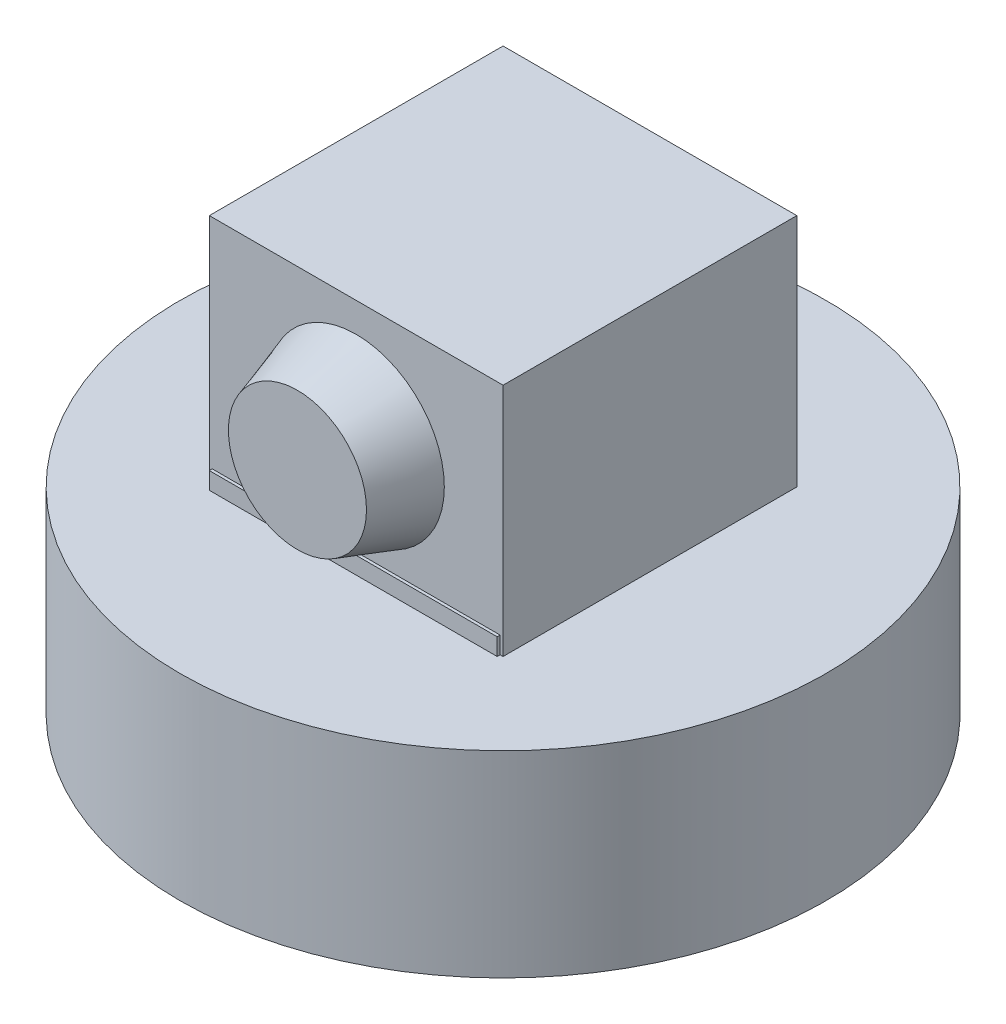
ISO-10303-21;
HEADER;
FILE_DESCRIPTION(('STEP AP214'),'2;1');
FILE_NAME('part.step','',(''),(''),'','','');
FILE_SCHEMA(('AUTOMOTIVE_DESIGN { 1 0 10303 214 1 1 1 1 }'));
ENDSEC;
DATA;
#1=APPLICATION_CONTEXT('core data for automotive mechanical design processes');
#2=APPLICATION_PROTOCOL_DEFINITION('international standard','automotive_design',2000,#1);
#3=PRODUCT_CONTEXT('',#1,'mechanical');
#4=PRODUCT('Part','Part','',(#3));
#5=PRODUCT_RELATED_PRODUCT_CATEGORY('part','',(#4));
#6=PRODUCT_DEFINITION_FORMATION('','',#4);
#7=PRODUCT_DEFINITION_CONTEXT('part definition',#1,'design');
#8=PRODUCT_DEFINITION('design','',#6,#7);
#9=PRODUCT_DEFINITION_SHAPE('','',#8);
#10=(LENGTH_UNIT() NAMED_UNIT(*) SI_UNIT(.MILLI.,.METRE.));
#11=(NAMED_UNIT(*) PLANE_ANGLE_UNIT() SI_UNIT($,.RADIAN.));
#12=(NAMED_UNIT(*) SI_UNIT($,.STERADIAN.) SOLID_ANGLE_UNIT());
#13=UNCERTAINTY_MEASURE_WITH_UNIT(LENGTH_MEASURE(1.E-05),#10,'distance_accuracy_value','');
#14=(GEOMETRIC_REPRESENTATION_CONTEXT(3) GLOBAL_UNCERTAINTY_ASSIGNED_CONTEXT((#13)) GLOBAL_UNIT_ASSIGNED_CONTEXT((#10,
#11,#12)) REPRESENTATION_CONTEXT('',''));
#15=CARTESIAN_POINT('',(0.,0.,0.));
#16=DIRECTION('',(0.,0.,1.));
#17=DIRECTION('',(1.,0.,0.));
#18=AXIS2_PLACEMENT_3D('',#15,#16,#17);
#19=CARTESIAN_POINT('',(0.,67.,0.));
#20=DIRECTION('',(0.,1.,0.));
#21=DIRECTION('',(0.,0.,1.));
#22=AXIS2_PLACEMENT_3D('',#19,#20,#21);
#23=PLANE('',#22);
#24=CARTESIAN_POINT('',(0.,67.,0.));
#25=DIRECTION('',(0.,1.,0.));
#26=DIRECTION('',(0.,0.,1.));
#27=AXIS2_PLACEMENT_3D('',#24,#25,#26);
#28=CIRCLE('',#27,110.);
#29=CARTESIAN_POINT('',(0.,67.,110.));
#30=VERTEX_POINT('',#29);
#31=EDGE_CURVE('E386',#30,#30,#28,.T.);
#32=ORIENTED_EDGE('',*,*,#31,.T.);
#33=EDGE_LOOP('',(#32));
#34=FACE_BOUND('',#33,.T.);
#35=DIRECTION('',(-1.,0.,0.));
#36=VECTOR('',#35,1.);
#37=CARTESIAN_POINT('',(0.,67.,51.));
#38=LINE('',#37,#36);
#39=CARTESIAN_POINT('',(49.,67.,51.));
#40=VERTEX_POINT('',#39);
#41=CARTESIAN_POINT('',(-49.,67.,51.));
#42=VERTEX_POINT('',#41);
#43=EDGE_CURVE('E277',#40,#42,#38,.T.);
#44=ORIENTED_EDGE('',*,*,#43,.T.);
#45=DIRECTION('',(0.,0.,-1.));
#46=VECTOR('',#45,1.);
#47=CARTESIAN_POINT('',(-49.,67.,0.));
#48=LINE('',#47,#46);
#49=CARTESIAN_POINT('',(-49.,67.,50.));
#50=VERTEX_POINT('',#49);
#51=EDGE_CURVE('E503',#42,#50,#48,.T.);
#52=ORIENTED_EDGE('',*,*,#51,.T.);
#53=DIRECTION('',(1.,0.,0.));
#54=VECTOR('',#53,1.);
#55=CARTESIAN_POINT('',(-50.,67.,50.));
#56=LINE('',#55,#54);
#57=CARTESIAN_POINT('',(-50.,67.,50.));
#58=VERTEX_POINT('',#57);
#59=EDGE_CURVE('E346',#58,#50,#56,.T.);
#60=ORIENTED_EDGE('',*,*,#59,.F.);
#61=DIRECTION('',(0.,0.,1.));
#62=VECTOR('',#61,1.);
#63=CARTESIAN_POINT('',(-50.,67.,-50.));
#64=LINE('',#63,#62);
#65=CARTESIAN_POINT('',(-50.,67.,-50.));
#66=VERTEX_POINT('',#65);
#67=EDGE_CURVE('E363',#66,#58,#64,.T.);
#68=ORIENTED_EDGE('',*,*,#67,.F.);
#69=DIRECTION('',(-1.,0.,0.));
#70=VECTOR('',#69,1.);
#71=CARTESIAN_POINT('',(-50.,67.,-50.));
#72=LINE('',#71,#70);
#73=CARTESIAN_POINT('',(50.,67.,-50.));
#74=VERTEX_POINT('',#73);
#75=EDGE_CURVE('E359',#74,#66,#72,.T.);
#76=ORIENTED_EDGE('',*,*,#75,.F.);
#77=DIRECTION('',(0.,0.,-1.));
#78=VECTOR('',#77,1.);
#79=CARTESIAN_POINT('',(50.,67.,-50.));
#80=LINE('',#79,#78);
#81=CARTESIAN_POINT('',(50.,67.,50.));
#82=VERTEX_POINT('',#81);
#83=EDGE_CURVE('E340',#82,#74,#80,.T.);
#84=ORIENTED_EDGE('',*,*,#83,.F.);
#85=CARTESIAN_POINT('',(49.,67.,50.));
#86=VERTEX_POINT('',#85);
#87=EDGE_CURVE('E367',#86,#82,#56,.T.);
#88=ORIENTED_EDGE('',*,*,#87,.F.);
#89=DIRECTION('',(0.,0.,1.));
#90=VECTOR('',#89,1.);
#91=CARTESIAN_POINT('',(49.,67.,0.));
#92=LINE('',#91,#90);
#93=EDGE_CURVE('E504',#86,#40,#92,.T.);
#94=ORIENTED_EDGE('',*,*,#93,.T.);
#95=EDGE_LOOP('',(#44,#52,#60,#68,#76,#84,#88,#94));
#96=FACE_BOUND('',#95,.T.);
#97=ADVANCED_FACE('F52',(#34,#96),#23,.T.);
#98=CARTESIAN_POINT('',(-50.,147.,50.));
#99=DIRECTION('',(0.,0.,-1.));
#100=DIRECTION('',(-1.,0.,0.));
#101=AXIS2_PLACEMENT_3D('',#98,#99,#100);
#102=PLANE('',#101);
#103=CARTESIAN_POINT('',(0.,107.,50.));
#104=DIRECTION('',(0.,0.,-1.));
#105=DIRECTION('',(-1.,0.,0.));
#106=AXIS2_PLACEMENT_3D('',#103,#104,#105);
#107=CIRCLE('',#106,30.);
#108=CARTESIAN_POINT('',(-30.,107.,50.));
#109=VERTEX_POINT('',#108);
#110=EDGE_CURVE('E62',#109,#109,#107,.F.);
#111=ORIENTED_EDGE('',*,*,#110,.F.);
#112=EDGE_LOOP('',(#111));
#113=FACE_BOUND('',#112,.T.);
#114=DIRECTION('',(0.,-1.,0.));
#115=VECTOR('',#114,1.);
#116=CARTESIAN_POINT('',(-49.,147.,50.));
#117=LINE('',#116,#115);
#118=CARTESIAN_POINT('',(-49.,72.8266894014951,50.));
#119=VERTEX_POINT('',#118);
#120=EDGE_CURVE('E495',#119,#50,#117,.T.);
#121=ORIENTED_EDGE('',*,*,#120,.F.);
#122=DIRECTION('',(-1.,0.,0.));
#123=VECTOR('',#122,1.);
#124=CARTESIAN_POINT('',(-50.,72.8266894014951,50.));
#125=LINE('',#124,#123);
#126=CARTESIAN_POINT('',(49.,72.8266894014951,50.));
#127=VERTEX_POINT('',#126);
#128=EDGE_CURVE('E497',#127,#119,#125,.T.);
#129=ORIENTED_EDGE('',*,*,#128,.F.);
#130=DIRECTION('',(0.,1.,0.));
#131=VECTOR('',#130,1.);
#132=CARTESIAN_POINT('',(49.,147.,50.));
#133=LINE('',#132,#131);
#134=EDGE_CURVE('E516',#86,#127,#133,.T.);
#135=ORIENTED_EDGE('',*,*,#134,.F.);
#136=ORIENTED_EDGE('',*,*,#87,.T.);
#137=DIRECTION('',(0.,-1.,0.));
#138=VECTOR('',#137,1.);
#139=CARTESIAN_POINT('',(50.,147.,50.));
#140=LINE('',#139,#138);
#141=CARTESIAN_POINT('',(50.,147.,50.));
#142=VERTEX_POINT('',#141);
#143=EDGE_CURVE('E355',#142,#82,#140,.T.);
#144=ORIENTED_EDGE('',*,*,#143,.F.);
#145=DIRECTION('',(1.,0.,0.));
#146=VECTOR('',#145,1.);
#147=CARTESIAN_POINT('',(-50.,147.,50.));
#148=LINE('',#147,#146);
#149=CARTESIAN_POINT('',(-50.,147.,50.));
#150=VERTEX_POINT('',#149);
#151=EDGE_CURVE('E352',#150,#142,#148,.T.);
#152=ORIENTED_EDGE('',*,*,#151,.F.);
#153=DIRECTION('',(0.,-1.,0.));
#154=VECTOR('',#153,1.);
#155=CARTESIAN_POINT('',(-50.,147.,50.));
#156=LINE('',#155,#154);
#157=EDGE_CURVE('E374',#150,#58,#156,.T.);
#158=ORIENTED_EDGE('',*,*,#157,.T.);
#159=ORIENTED_EDGE('',*,*,#59,.T.);
#160=EDGE_LOOP('',(#121,#129,#135,#136,#144,#152,#158,#159));
#161=FACE_BOUND('',#160,.T.);
#162=ADVANCED_FACE('F489',(#113,#161),#102,.F.);
#163=CARTESIAN_POINT('',(0.,0.,0.));
#164=DIRECTION('',(0.,1.,0.));
#165=DIRECTION('',(0.,0.,1.));
#166=AXIS2_PLACEMENT_3D('',#163,#164,#165);
#167=PLANE('',#166);
#168=CARTESIAN_POINT('',(0.,0.,0.));
#169=DIRECTION('',(0.,1.,0.));
#170=DIRECTION('',(0.,0.,1.));
#171=AXIS2_PLACEMENT_3D('',#168,#169,#170);
#172=CIRCLE('',#171,110.);
#173=CARTESIAN_POINT('',(0.,0.,110.));
#174=VERTEX_POINT('',#173);
#175=EDGE_CURVE('E480',#174,#174,#172,.T.);
#176=ORIENTED_EDGE('',*,*,#175,.F.);
#177=EDGE_LOOP('',(#176));
#178=FACE_BOUND('',#177,.T.);
#179=CARTESIAN_POINT('',(0.,0.,0.));
#180=DIRECTION('',(0.,1.,0.));
#181=DIRECTION('',(0.,0.,1.));
#182=AXIS2_PLACEMENT_3D('',#179,#180,#181);
#183=CIRCLE('',#182,9.45);
#184=CARTESIAN_POINT('',(-4.5,0.,-8.30978339067872));
#185=VERTEX_POINT('',#184);
#186=CARTESIAN_POINT('',(-4.5,0.,8.30978339067872));
#187=VERTEX_POINT('',#186);
#188=EDGE_CURVE('E390',#185,#187,#183,.T.);
#189=ORIENTED_EDGE('',*,*,#188,.T.);
#190=DIRECTION('',(0.,0.,1.));
#191=VECTOR('',#190,1.);
#192=CARTESIAN_POINT('',(-4.5,0.,8.30978339067872));
#193=LINE('',#192,#191);
#194=CARTESIAN_POINT('',(-4.5,0.,23.3097833906787));
#195=VERTEX_POINT('',#194);
#196=EDGE_CURVE('E428',#187,#195,#193,.T.);
#197=ORIENTED_EDGE('',*,*,#196,.T.);
#198=DIRECTION('',(1.,0.,0.));
#199=VECTOR('',#198,1.);
#200=CARTESIAN_POINT('',(-4.5,0.,23.3097833906787));
#201=LINE('',#200,#199);
#202=CARTESIAN_POINT('',(4.5,0.,23.3097833906787));
#203=VERTEX_POINT('',#202);
#204=EDGE_CURVE('E432',#195,#203,#201,.T.);
#205=ORIENTED_EDGE('',*,*,#204,.T.);
#206=DIRECTION('',(0.,0.,-1.));
#207=VECTOR('',#206,1.);
#208=CARTESIAN_POINT('',(4.5,0.,23.3097833906787));
#209=LINE('',#208,#207);
#210=CARTESIAN_POINT('',(4.5,0.,8.30978339067872));
#211=VERTEX_POINT('',#210);
#212=EDGE_CURVE('E436',#203,#211,#209,.T.);
#213=ORIENTED_EDGE('',*,*,#212,.T.);
#214=CARTESIAN_POINT('',(0.,0.,0.));
#215=DIRECTION('',(0.,1.,0.));
#216=DIRECTION('',(0.,0.,1.));
#217=AXIS2_PLACEMENT_3D('',#214,#215,#216);
#218=CIRCLE('',#217,9.45);
#219=CARTESIAN_POINT('',(4.5,0.,-8.30978339067872));
#220=VERTEX_POINT('',#219);
#221=EDGE_CURVE('E440',#211,#220,#218,.T.);
#222=ORIENTED_EDGE('',*,*,#221,.T.);
#223=DIRECTION('',(0.,0.,-1.));
#224=VECTOR('',#223,1.);
#225=CARTESIAN_POINT('',(4.5,0.,-23.3097833906787));
#226=LINE('',#225,#224);
#227=CARTESIAN_POINT('',(4.5,0.,-23.3097833906787));
#228=VERTEX_POINT('',#227);
#229=EDGE_CURVE('E444',#220,#228,#226,.T.);
#230=ORIENTED_EDGE('',*,*,#229,.T.);
#231=DIRECTION('',(-1.,0.,0.));
#232=VECTOR('',#231,1.);
#233=CARTESIAN_POINT('',(-4.5,0.,-23.3097833906787));
#234=LINE('',#233,#232);
#235=CARTESIAN_POINT('',(-4.5,0.,-23.3097833906787));
#236=VERTEX_POINT('',#235);
#237=EDGE_CURVE('E448',#228,#236,#234,.T.);
#238=ORIENTED_EDGE('',*,*,#237,.T.);
#239=DIRECTION('',(0.,0.,1.));
#240=VECTOR('',#239,1.);
#241=CARTESIAN_POINT('',(-4.5,0.,-8.30978339067872));
#242=LINE('',#241,#240);
#243=EDGE_CURVE('E396',#236,#185,#242,.T.);
#244=ORIENTED_EDGE('',*,*,#243,.T.);
#245=EDGE_LOOP('',(#189,#197,#205,#213,#222,#230,#238,#244));
#246=FACE_BOUND('',#245,.T.);
#247=ADVANCED_FACE('F492',(#178,#246),#167,.F.);
#248=CARTESIAN_POINT('',(0.,12.,0.));
#249=DIRECTION('',(0.,-1.,0.));
#250=DIRECTION('',(0.,0.,-1.));
#251=AXIS2_PLACEMENT_3D('',#248,#249,#250);
#252=CYLINDRICAL_SURFACE('',#251,110.);
#253=ORIENTED_EDGE('',*,*,#175,.T.);
#254=EDGE_LOOP('',(#253));
#255=FACE_BOUND('',#254,.T.);
#256=ORIENTED_EDGE('',*,*,#31,.F.);
#257=EDGE_LOOP('',(#256));
#258=FACE_BOUND('',#257,.T.);
#259=ADVANCED_FACE('F54',(#255,#258),#252,.T.);
#260=CARTESIAN_POINT('',(0.,12.,0.));
#261=DIRECTION('',(0.,-1.,0.));
#262=DIRECTION('',(0.,0.,-1.));
#263=AXIS2_PLACEMENT_3D('',#260,#261,#262);
#264=CYLINDRICAL_SURFACE('',#263,9.45);
#265=ORIENTED_EDGE('',*,*,#188,.F.);
#266=DIRECTION('',(0.,-1.,0.));
#267=VECTOR('',#266,1.);
#268=CARTESIAN_POINT('',(-4.5,12.,-8.30978339067872));
#269=LINE('',#268,#267);
#270=CARTESIAN_POINT('',(-4.5,12.,-8.30978339067872));
#271=VERTEX_POINT('',#270);
#272=EDGE_CURVE('E424',#271,#185,#269,.T.);
#273=ORIENTED_EDGE('',*,*,#272,.F.);
#274=CARTESIAN_POINT('',(0.,12.,0.));
#275=DIRECTION('',(0.,1.,0.));
#276=DIRECTION('',(0.,0.,1.));
#277=AXIS2_PLACEMENT_3D('',#274,#275,#276);
#278=CIRCLE('',#277,9.45);
#279=CARTESIAN_POINT('',(-4.5,12.,8.30978339067872));
#280=VERTEX_POINT('',#279);
#281=EDGE_CURVE('E391',#271,#280,#278,.T.);
#282=ORIENTED_EDGE('',*,*,#281,.T.);
#283=DIRECTION('',(0.,-1.,0.));
#284=VECTOR('',#283,1.);
#285=CARTESIAN_POINT('',(-4.5,12.,8.30978339067872));
#286=LINE('',#285,#284);
#287=EDGE_CURVE('E476',#280,#187,#286,.T.);
#288=ORIENTED_EDGE('',*,*,#287,.T.);
#289=EDGE_LOOP('',(#265,#273,#282,#288));
#290=FACE_BOUND('',#289,.T.);
#291=ADVANCED_FACE('F693',(#290),#264,.F.);
#292=CARTESIAN_POINT('',(-4.5,12.,8.30978339067872));
#293=DIRECTION('',(1.,0.,0.));
#294=DIRECTION('',(0.,0.,-1.));
#295=AXIS2_PLACEMENT_3D('',#292,#293,#294);
#296=PLANE('',#295);
#297=ORIENTED_EDGE('',*,*,#196,.F.);
#298=ORIENTED_EDGE('',*,*,#287,.F.);
#299=DIRECTION('',(0.,0.,1.));
#300=VECTOR('',#299,1.);
#301=CARTESIAN_POINT('',(-4.5,12.,8.30978339067872));
#302=LINE('',#301,#300);
#303=CARTESIAN_POINT('',(-4.5,12.,23.3097833906787));
#304=VERTEX_POINT('',#303);
#305=EDGE_CURVE('E395',#280,#304,#302,.T.);
#306=ORIENTED_EDGE('',*,*,#305,.T.);
#307=DIRECTION('',(0.,-1.,0.));
#308=VECTOR('',#307,1.);
#309=CARTESIAN_POINT('',(-4.5,12.,23.3097833906787));
#310=LINE('',#309,#308);
#311=EDGE_CURVE('E473',#304,#195,#310,.T.);
#312=ORIENTED_EDGE('',*,*,#311,.T.);
#313=EDGE_LOOP('',(#297,#298,#306,#312));
#314=FACE_BOUND('',#313,.T.);
#315=ADVANCED_FACE('F689',(#314),#296,.T.);
#316=CARTESIAN_POINT('',(-4.5,12.,23.3097833906787));
#317=DIRECTION('',(0.,0.,-1.));
#318=DIRECTION('',(-1.,0.,0.));
#319=AXIS2_PLACEMENT_3D('',#316,#317,#318);
#320=PLANE('',#319);
#321=ORIENTED_EDGE('',*,*,#204,.F.);
#322=ORIENTED_EDGE('',*,*,#311,.F.);
#323=DIRECTION('',(1.,0.,0.));
#324=VECTOR('',#323,1.);
#325=CARTESIAN_POINT('',(-4.5,12.,23.3097833906787));
#326=LINE('',#325,#324);
#327=CARTESIAN_POINT('',(4.5,12.,23.3097833906787));
#328=VERTEX_POINT('',#327);
#329=EDGE_CURVE('E400',#304,#328,#326,.T.);
#330=ORIENTED_EDGE('',*,*,#329,.T.);
#331=DIRECTION('',(0.,-1.,0.));
#332=VECTOR('',#331,1.);
#333=CARTESIAN_POINT('',(4.5,12.,23.3097833906787));
#334=LINE('',#333,#332);
#335=EDGE_CURVE('E470',#328,#203,#334,.T.);
#336=ORIENTED_EDGE('',*,*,#335,.T.);
#337=EDGE_LOOP('',(#321,#322,#330,#336));
#338=FACE_BOUND('',#337,.T.);
#339=ADVANCED_FACE('F685',(#338),#320,.T.);
#340=CARTESIAN_POINT('',(4.5,12.,23.3097833906787));
#341=DIRECTION('',(-1.,0.,0.));
#342=DIRECTION('',(0.,0.,1.));
#343=AXIS2_PLACEMENT_3D('',#340,#341,#342);
#344=PLANE('',#343);
#345=ORIENTED_EDGE('',*,*,#212,.F.);
#346=ORIENTED_EDGE('',*,*,#335,.F.);
#347=DIRECTION('',(0.,0.,-1.));
#348=VECTOR('',#347,1.);
#349=CARTESIAN_POINT('',(4.5,12.,23.3097833906787));
#350=LINE('',#349,#348);
#351=CARTESIAN_POINT('',(4.5,12.,8.30978339067872));
#352=VERTEX_POINT('',#351);
#353=EDGE_CURVE('E404',#328,#352,#350,.T.);
#354=ORIENTED_EDGE('',*,*,#353,.T.);
#355=DIRECTION('',(0.,-1.,0.));
#356=VECTOR('',#355,1.);
#357=CARTESIAN_POINT('',(4.5,12.,8.30978339067872));
#358=LINE('',#357,#356);
#359=EDGE_CURVE('E467',#352,#211,#358,.T.);
#360=ORIENTED_EDGE('',*,*,#359,.T.);
#361=EDGE_LOOP('',(#345,#346,#354,#360));
#362=FACE_BOUND('',#361,.T.);
#363=ADVANCED_FACE('F681',(#362),#344,.T.);
#364=CARTESIAN_POINT('',(0.,12.,0.));
#365=DIRECTION('',(0.,-1.,0.));
#366=DIRECTION('',(0.,0.,-1.));
#367=AXIS2_PLACEMENT_3D('',#364,#365,#366);
#368=CYLINDRICAL_SURFACE('',#367,9.45);
#369=ORIENTED_EDGE('',*,*,#221,.F.);
#370=ORIENTED_EDGE('',*,*,#359,.F.);
#371=CARTESIAN_POINT('',(0.,12.,0.));
#372=DIRECTION('',(0.,1.,0.));
#373=DIRECTION('',(0.,0.,1.));
#374=AXIS2_PLACEMENT_3D('',#371,#372,#373);
#375=CIRCLE('',#374,9.45);
#376=CARTESIAN_POINT('',(4.5,12.,-8.30978339067872));
#377=VERTEX_POINT('',#376);
#378=EDGE_CURVE('E408',#352,#377,#375,.T.);
#379=ORIENTED_EDGE('',*,*,#378,.T.);
#380=DIRECTION('',(0.,-1.,0.));
#381=VECTOR('',#380,1.);
#382=CARTESIAN_POINT('',(4.5,12.,-8.30978339067872));
#383=LINE('',#382,#381);
#384=EDGE_CURVE('E464',#377,#220,#383,.T.);
#385=ORIENTED_EDGE('',*,*,#384,.T.);
#386=EDGE_LOOP('',(#369,#370,#379,#385));
#387=FACE_BOUND('',#386,.T.);
#388=ADVANCED_FACE('F677',(#387),#368,.F.);
#389=CARTESIAN_POINT('',(4.5,12.,-23.3097833906787));
#390=DIRECTION('',(-1.,0.,0.));
#391=DIRECTION('',(0.,0.,1.));
#392=AXIS2_PLACEMENT_3D('',#389,#390,#391);
#393=PLANE('',#392);
#394=ORIENTED_EDGE('',*,*,#229,.F.);
#395=ORIENTED_EDGE('',*,*,#384,.F.);
#396=DIRECTION('',(0.,0.,-1.));
#397=VECTOR('',#396,1.);
#398=CARTESIAN_POINT('',(4.5,12.,-23.3097833906787));
#399=LINE('',#398,#397);
#400=CARTESIAN_POINT('',(4.5,12.,-23.3097833906787));
#401=VERTEX_POINT('',#400);
#402=EDGE_CURVE('E412',#377,#401,#399,.T.);
#403=ORIENTED_EDGE('',*,*,#402,.T.);
#404=DIRECTION('',(0.,-1.,0.));
#405=VECTOR('',#404,1.);
#406=CARTESIAN_POINT('',(4.5,12.,-23.3097833906787));
#407=LINE('',#406,#405);
#408=EDGE_CURVE('E461',#401,#228,#407,.T.);
#409=ORIENTED_EDGE('',*,*,#408,.T.);
#410=EDGE_LOOP('',(#394,#395,#403,#409));
#411=FACE_BOUND('',#410,.T.);
#412=ADVANCED_FACE('F673',(#411),#393,.T.);
#413=CARTESIAN_POINT('',(-4.5,12.,-23.3097833906787));
#414=DIRECTION('',(0.,0.,1.));
#415=DIRECTION('',(1.,0.,0.));
#416=AXIS2_PLACEMENT_3D('',#413,#414,#415);
#417=PLANE('',#416);
#418=ORIENTED_EDGE('',*,*,#237,.F.);
#419=ORIENTED_EDGE('',*,*,#408,.F.);
#420=DIRECTION('',(-1.,0.,0.));
#421=VECTOR('',#420,1.);
#422=CARTESIAN_POINT('',(-4.5,12.,-23.3097833906787));
#423=LINE('',#422,#421);
#424=CARTESIAN_POINT('',(-4.5,12.,-23.3097833906787));
#425=VERTEX_POINT('',#424);
#426=EDGE_CURVE('E416',#401,#425,#423,.T.);
#427=ORIENTED_EDGE('',*,*,#426,.T.);
#428=DIRECTION('',(0.,-1.,0.));
#429=VECTOR('',#428,1.);
#430=CARTESIAN_POINT('',(-4.5,12.,-23.3097833906787));
#431=LINE('',#430,#429);
#432=EDGE_CURVE('E458',#425,#236,#431,.T.);
#433=ORIENTED_EDGE('',*,*,#432,.T.);
#434=EDGE_LOOP('',(#418,#419,#427,#433));
#435=FACE_BOUND('',#434,.T.);
#436=ADVANCED_FACE('F669',(#435),#417,.T.);
#437=CARTESIAN_POINT('',(-4.5,12.,-8.30978339067872));
#438=DIRECTION('',(1.,0.,0.));
#439=DIRECTION('',(0.,0.,-1.));
#440=AXIS2_PLACEMENT_3D('',#437,#438,#439);
#441=PLANE('',#440);
#442=ORIENTED_EDGE('',*,*,#243,.F.);
#443=ORIENTED_EDGE('',*,*,#432,.F.);
#444=DIRECTION('',(0.,0.,1.));
#445=VECTOR('',#444,1.);
#446=CARTESIAN_POINT('',(-4.5,12.,-8.30978339067872));
#447=LINE('',#446,#445);
#448=EDGE_CURVE('E420',#425,#271,#447,.T.);
#449=ORIENTED_EDGE('',*,*,#448,.T.);
#450=ORIENTED_EDGE('',*,*,#272,.T.);
#451=EDGE_LOOP('',(#442,#443,#449,#450));
#452=FACE_BOUND('',#451,.T.);
#453=ADVANCED_FACE('F665',(#452),#441,.T.);
#454=CARTESIAN_POINT('',(0.,12.,0.));
#455=DIRECTION('',(0.,1.,0.));
#456=DIRECTION('',(0.,0.,1.));
#457=AXIS2_PLACEMENT_3D('',#454,#455,#456);
#458=PLANE('',#457);
#459=ORIENTED_EDGE('',*,*,#305,.F.);
#460=ORIENTED_EDGE('',*,*,#281,.F.);
#461=ORIENTED_EDGE('',*,*,#448,.F.);
#462=ORIENTED_EDGE('',*,*,#426,.F.);
#463=ORIENTED_EDGE('',*,*,#402,.F.);
#464=ORIENTED_EDGE('',*,*,#378,.F.);
#465=ORIENTED_EDGE('',*,*,#353,.F.);
#466=ORIENTED_EDGE('',*,*,#329,.F.);
#467=EDGE_LOOP('',(#459,#460,#461,#462,#463,#464,#465,#466));
#468=FACE_BOUND('',#467,.T.);
#469=ADVANCED_FACE('F658',(#468),#458,.F.);
#470=CARTESIAN_POINT('',(50.,147.,-50.));
#471=DIRECTION('',(-1.,0.,0.));
#472=DIRECTION('',(0.,0.,1.));
#473=AXIS2_PLACEMENT_3D('',#470,#471,#472);
#474=PLANE('',#473);
#475=ORIENTED_EDGE('',*,*,#83,.T.);
#476=DIRECTION('',(0.,-1.,0.));
#477=VECTOR('',#476,1.);
#478=CARTESIAN_POINT('',(50.,147.,-50.));
#479=LINE('',#478,#477);
#480=CARTESIAN_POINT('',(50.,147.,-50.));
#481=VERTEX_POINT('',#480);
#482=EDGE_CURVE('E382',#481,#74,#479,.T.);
#483=ORIENTED_EDGE('',*,*,#482,.F.);
#484=DIRECTION('',(0.,0.,-1.));
#485=VECTOR('',#484,1.);
#486=CARTESIAN_POINT('',(50.,147.,-50.));
#487=LINE('',#486,#485);
#488=EDGE_CURVE('E341',#142,#481,#487,.T.);
#489=ORIENTED_EDGE('',*,*,#488,.F.);
#490=ORIENTED_EDGE('',*,*,#143,.T.);
#491=EDGE_LOOP('',(#475,#483,#489,#490));
#492=FACE_BOUND('',#491,.T.);
#493=ADVANCED_FACE('F654',(#492),#474,.F.);
#494=CARTESIAN_POINT('',(-50.,147.,-50.));
#495=DIRECTION('',(0.,0.,1.));
#496=DIRECTION('',(1.,0.,0.));
#497=AXIS2_PLACEMENT_3D('',#494,#495,#496);
#498=PLANE('',#497);
#499=ORIENTED_EDGE('',*,*,#75,.T.);
#500=DIRECTION('',(0.,-1.,0.));
#501=VECTOR('',#500,1.);
#502=CARTESIAN_POINT('',(-50.,147.,-50.));
#503=LINE('',#502,#501);
#504=CARTESIAN_POINT('',(-50.,147.,-50.));
#505=VERTEX_POINT('',#504);
#506=EDGE_CURVE('E378',#505,#66,#503,.T.);
#507=ORIENTED_EDGE('',*,*,#506,.F.);
#508=DIRECTION('',(-1.,0.,0.));
#509=VECTOR('',#508,1.);
#510=CARTESIAN_POINT('',(-50.,147.,-50.));
#511=LINE('',#510,#509);
#512=EDGE_CURVE('E345',#481,#505,#511,.T.);
#513=ORIENTED_EDGE('',*,*,#512,.F.);
#514=ORIENTED_EDGE('',*,*,#482,.T.);
#515=EDGE_LOOP('',(#499,#507,#513,#514));
#516=FACE_BOUND('',#515,.T.);
#517=ADVANCED_FACE('F650',(#516),#498,.F.);
#518=CARTESIAN_POINT('',(-50.,147.,-50.));
#519=DIRECTION('',(1.,0.,0.));
#520=DIRECTION('',(0.,0.,-1.));
#521=AXIS2_PLACEMENT_3D('',#518,#519,#520);
#522=PLANE('',#521);
#523=ORIENTED_EDGE('',*,*,#67,.T.);
#524=ORIENTED_EDGE('',*,*,#157,.F.);
#525=DIRECTION('',(0.,0.,1.));
#526=VECTOR('',#525,1.);
#527=CARTESIAN_POINT('',(-50.,147.,-50.));
#528=LINE('',#527,#526);
#529=EDGE_CURVE('E349',#505,#150,#528,.T.);
#530=ORIENTED_EDGE('',*,*,#529,.F.);
#531=ORIENTED_EDGE('',*,*,#506,.T.);
#532=EDGE_LOOP('',(#523,#524,#530,#531));
#533=FACE_BOUND('',#532,.T.);
#534=ADVANCED_FACE('F645',(#533),#522,.F.);
#535=CARTESIAN_POINT('',(0.,147.,0.));
#536=DIRECTION('',(0.,1.,0.));
#537=DIRECTION('',(0.,0.,1.));
#538=AXIS2_PLACEMENT_3D('',#535,#536,#537);
#539=PLANE('',#538);
#540=ORIENTED_EDGE('',*,*,#488,.T.);
#541=ORIENTED_EDGE('',*,*,#512,.T.);
#542=ORIENTED_EDGE('',*,*,#529,.T.);
#543=ORIENTED_EDGE('',*,*,#151,.T.);
#544=EDGE_LOOP('',(#540,#541,#542,#543));
#545=FACE_BOUND('',#544,.T.);
#546=ADVANCED_FACE('F642',(#545),#539,.T.);
#547=CARTESIAN_POINT('',(0.,107.,50.));
#548=DIRECTION('',(0.,0.,-1.));
#549=DIRECTION('',(1.,0.,0.));
#550=AXIS2_PLACEMENT_3D('',#547,#548,#549);
#551=CONICAL_SURFACE('',#550,30.,0.314159265358979);
#552=CARTESIAN_POINT('',(0.,107.,70.));
#553=DIRECTION('',(0.,0.,1.));
#554=DIRECTION('',(1.,0.,0.));
#555=AXIS2_PLACEMENT_3D('',#552,#553,#554);
#556=CIRCLE('',#555,23.5016060753419);
#557=CARTESIAN_POINT('',(23.5016060753419,107.,70.));
#558=VERTEX_POINT('',#557);
#559=EDGE_CURVE('E272',#558,#558,#556,.T.);
#560=ORIENTED_EDGE('',*,*,#559,.F.);
#561=EDGE_LOOP('',(#560));
#562=FACE_BOUND('',#561,.T.);
#563=ORIENTED_EDGE('',*,*,#110,.T.);
#564=EDGE_LOOP('',(#563));
#565=FACE_BOUND('',#564,.T.);
#566=ADVANCED_FACE('F487',(#562,#565),#551,.T.);
#567=CARTESIAN_POINT('',(0.,107.,70.));
#568=DIRECTION('',(0.,0.,1.));
#569=DIRECTION('',(1.,0.,0.));
#570=AXIS2_PLACEMENT_3D('',#567,#568,#569);
#571=PLANE('',#570);
#572=ORIENTED_EDGE('',*,*,#559,.T.);
#573=EDGE_LOOP('',(#572));
#574=FACE_BOUND('',#573,.T.);
#575=ADVANCED_FACE('F636',(#574),#571,.T.);
#576=CARTESIAN_POINT('',(-49.,66.,51.));
#577=DIRECTION('',(1.,0.,0.));
#578=DIRECTION('',(0.,0.,-1.));
#579=AXIS2_PLACEMENT_3D('',#576,#577,#578);
#580=PLANE('',#579);
#581=ORIENTED_EDGE('',*,*,#51,.F.);
#582=DIRECTION('',(0.,-1.,0.));
#583=VECTOR('',#582,1.);
#584=CARTESIAN_POINT('',(-49.,66.,51.));
#585=LINE('',#584,#583);
#586=CARTESIAN_POINT('',(-49.,72.8266894014951,51.));
#587=VERTEX_POINT('',#586);
#588=EDGE_CURVE('E520',#587,#42,#585,.T.);
#589=ORIENTED_EDGE('',*,*,#588,.F.);
#590=DIRECTION('',(0.,0.,-1.));
#591=VECTOR('',#590,1.);
#592=CARTESIAN_POINT('',(-49.,72.8266894014951,51.));
#593=LINE('',#592,#591);
#594=EDGE_CURVE('E511',#587,#119,#593,.T.);
#595=ORIENTED_EDGE('',*,*,#594,.T.);
#596=ORIENTED_EDGE('',*,*,#120,.T.);
#597=EDGE_LOOP('',(#581,#589,#595,#596));
#598=FACE_BOUND('',#597,.T.);
#599=ADVANCED_FACE('F518',(#598),#580,.F.);
#600=CARTESIAN_POINT('',(49.,66.,51.));
#601=DIRECTION('',(-1.,0.,0.));
#602=DIRECTION('',(0.,0.,1.));
#603=AXIS2_PLACEMENT_3D('',#600,#601,#602);
#604=PLANE('',#603);
#605=ORIENTED_EDGE('',*,*,#93,.F.);
#606=ORIENTED_EDGE('',*,*,#134,.T.);
#607=DIRECTION('',(0.,0.,-1.));
#608=VECTOR('',#607,1.);
#609=CARTESIAN_POINT('',(49.,72.8266894014951,51.));
#610=LINE('',#609,#608);
#611=CARTESIAN_POINT('',(49.,72.8266894014951,51.));
#612=VERTEX_POINT('',#611);
#613=EDGE_CURVE('E514',#612,#127,#610,.T.);
#614=ORIENTED_EDGE('',*,*,#613,.F.);
#615=DIRECTION('',(0.,1.,0.));
#616=VECTOR('',#615,1.);
#617=CARTESIAN_POINT('',(49.,66.,51.));
#618=LINE('',#617,#616);
#619=EDGE_CURVE('E729',#40,#612,#618,.T.);
#620=ORIENTED_EDGE('',*,*,#619,.F.);
#621=EDGE_LOOP('',(#605,#606,#614,#620));
#622=FACE_BOUND('',#621,.T.);
#623=ADVANCED_FACE('F760',(#622),#604,.F.);
#624=CARTESIAN_POINT('',(-49.,72.8266894014951,51.));
#625=DIRECTION('',(0.,-1.,0.));
#626=DIRECTION('',(0.,0.,-1.));
#627=AXIS2_PLACEMENT_3D('',#624,#625,#626);
#628=PLANE('',#627);
#629=ORIENTED_EDGE('',*,*,#613,.T.);
#630=ORIENTED_EDGE('',*,*,#128,.T.);
#631=ORIENTED_EDGE('',*,*,#594,.F.);
#632=DIRECTION('',(-1.,0.,0.));
#633=VECTOR('',#632,1.);
#634=CARTESIAN_POINT('',(-49.,72.8266894014951,51.));
#635=LINE('',#634,#633);
#636=EDGE_CURVE('E529',#612,#587,#635,.T.);
#637=ORIENTED_EDGE('',*,*,#636,.F.);
#638=EDGE_LOOP('',(#629,#630,#631,#637));
#639=FACE_BOUND('',#638,.T.);
#640=ADVANCED_FACE('F509',(#639),#628,.F.);
#641=CARTESIAN_POINT('',(0.,0.,51.));
#642=DIRECTION('',(0.,0.,-1.));
#643=DIRECTION('',(-1.,0.,0.));
#644=AXIS2_PLACEMENT_3D('',#641,#642,#643);
#645=PLANE('',#644);
#646=ORIENTED_EDGE('',*,*,#43,.F.);
#647=ORIENTED_EDGE('',*,*,#619,.T.);
#648=ORIENTED_EDGE('',*,*,#636,.T.);
#649=ORIENTED_EDGE('',*,*,#588,.T.);
#650=EDGE_LOOP('',(#646,#647,#648,#649));
#651=FACE_BOUND('',#650,.T.);
#652=ADVANCED_FACE('F727',(#651),#645,.F.);
#653=CLOSED_SHELL('',(#97,#162,#247,#259,#291,#315,#339,#363,#388,#412,#436,#453,#469,#493,#517,
#534,#546,#566,#575,#599,#623,#640,#652));
#654=CARTESIAN_POINT('',(0.,107.,69.));
#655=DIRECTION('',(0.,0.,1.));
#656=DIRECTION('',(1.,0.,0.));
#657=AXIS2_PLACEMENT_3D('',#654,#655,#656);
#658=PLANE('',#657);
#659=CARTESIAN_POINT('',(0.,107.,69.));
#660=DIRECTION('',(0.,0.,1.));
#661=DIRECTION('',(1.,0.,0.));
#662=AXIS2_PLACEMENT_3D('',#659,#660,#661);
#663=CIRCLE('',#662,22.7750635473365);
#664=CARTESIAN_POINT('',(22.7750635473365,107.,69.));
#665=VERTEX_POINT('',#664);
#666=EDGE_CURVE('E265',#665,#665,#663,.T.);
#667=ORIENTED_EDGE('',*,*,#666,.F.);
#668=EDGE_LOOP('',(#667));
#669=FACE_BOUND('',#668,.T.);
#670=ADVANCED_FACE('F621',(#669),#658,.F.);
#671=CARTESIAN_POINT('',(0.,107.,49.6909830056251));
#672=DIRECTION('',(0.,0.,-1.));
#673=DIRECTION('',(1.,0.,0.));
#674=AXIS2_PLACEMENT_3D('',#671,#672,#673);
#675=CONICAL_SURFACE('',#674,29.0489434837048,0.314159265358979);
#676=ORIENTED_EDGE('',*,*,#666,.T.);
#677=EDGE_LOOP('',(#676));
#678=FACE_BOUND('',#677,.T.);
#679=CARTESIAN_POINT('',(0.,107.,49.));
#680=DIRECTION('',(0.,0.,-1.));
#681=DIRECTION('',(-1.,0.,0.));
#682=AXIS2_PLACEMENT_3D('',#679,#680,#681);
#683=CIRCLE('',#682,29.2734574719946);
#684=CARTESIAN_POINT('',(-29.2734574719946,107.,49.));
#685=VERTEX_POINT('',#684);
#686=EDGE_CURVE('E268',#685,#685,#683,.F.);
#687=ORIENTED_EDGE('',*,*,#686,.F.);
#688=EDGE_LOOP('',(#687));
#689=FACE_BOUND('',#688,.T.);
#690=ADVANCED_FACE('F623',(#678,#689),#675,.F.);
#691=CARTESIAN_POINT('',(49.,72.8266894014951,49.));
#692=VERTEX_POINT('',#691);
#693=CARTESIAN_POINT('',(49.,72.8266894014951,-34.));
#694=VERTEX_POINT('',#693);
#695=EDGE_CURVE('E522',#692,#694,#610,.T.);
#696=ORIENTED_EDGE('',*,*,#695,.T.);
#697=DIRECTION('',(1.,0.,0.));
#698=VECTOR('',#697,1.);
#699=CARTESIAN_POINT('',(-49.,72.8266894014951,-34.));
#700=LINE('',#699,#698);
#701=CARTESIAN_POINT('',(-49.,72.8266894014951,-34.));
#702=VERTEX_POINT('',#701);
#703=EDGE_CURVE('E735',#702,#694,#700,.T.);
#704=ORIENTED_EDGE('',*,*,#703,.F.);
#705=CARTESIAN_POINT('',(-49.,72.8266894014951,49.));
#706=VERTEX_POINT('',#705);
#707=EDGE_CURVE('E523',#706,#702,#593,.T.);
#708=ORIENTED_EDGE('',*,*,#707,.F.);
#709=DIRECTION('',(-1.,0.,0.));
#710=VECTOR('',#709,1.);
#711=CARTESIAN_POINT('',(-50.,72.8266894014951,49.));
#712=LINE('',#711,#710);
#713=EDGE_CURVE('E13',#692,#706,#712,.T.);
#714=ORIENTED_EDGE('',*,*,#713,.F.);
#715=EDGE_LOOP('',(#696,#704,#708,#714));
#716=FACE_BOUND('',#715,.T.);
#717=ADVANCED_FACE('F630',(#716),#628,.F.);
#718=CARTESIAN_POINT('',(-50.,147.,49.));
#719=DIRECTION('',(0.,0.,-1.));
#720=DIRECTION('',(-1.,0.,0.));
#721=AXIS2_PLACEMENT_3D('',#718,#719,#720);
#722=PLANE('',#721);
#723=ORIENTED_EDGE('',*,*,#686,.T.);
#724=EDGE_LOOP('',(#723));
#725=FACE_BOUND('',#724,.T.);
#726=DIRECTION('',(0.,-1.,0.));
#727=VECTOR('',#726,1.);
#728=CARTESIAN_POINT('',(-49.,147.,49.));
#729=LINE('',#728,#727);
#730=CARTESIAN_POINT('',(-49.,142.077401781535,49.));
#731=VERTEX_POINT('',#730);
#732=EDGE_CURVE('E250',#731,#706,#729,.T.);
#733=ORIENTED_EDGE('',*,*,#732,.F.);
#734=DIRECTION('',(1.,0.,0.));
#735=VECTOR('',#734,1.);
#736=CARTESIAN_POINT('',(-49.,142.077401781535,49.));
#737=LINE('',#736,#735);
#738=CARTESIAN_POINT('',(49.,142.077401781535,49.));
#739=VERTEX_POINT('',#738);
#740=EDGE_CURVE('E237',#731,#739,#737,.T.);
#741=ORIENTED_EDGE('',*,*,#740,.T.);
#742=DIRECTION('',(0.,-1.,0.));
#743=VECTOR('',#742,1.);
#744=CARTESIAN_POINT('',(49.,147.,49.));
#745=LINE('',#744,#743);
#746=EDGE_CURVE('E258',#739,#692,#745,.T.);
#747=ORIENTED_EDGE('',*,*,#746,.T.);
#748=ORIENTED_EDGE('',*,*,#713,.T.);
#749=EDGE_LOOP('',(#733,#741,#747,#748));
#750=FACE_BOUND('',#749,.T.);
#751=ADVANCED_FACE('F254',(#725,#750),#722,.T.);
#752=CARTESIAN_POINT('',(0.,0.,-34.));
#753=DIRECTION('',(0.,0.,1.));
#754=DIRECTION('',(1.,0.,0.));
#755=AXIS2_PLACEMENT_3D('',#752,#753,#754);
#756=PLANE('',#755);
#757=DIRECTION('',(0.,1.,0.));
#758=VECTOR('',#757,1.);
#759=CARTESIAN_POINT('',(49.,147.,-34.));
#760=LINE('',#759,#758);
#761=CARTESIAN_POINT('',(49.,142.077401781535,-34.));
#762=VERTEX_POINT('',#761);
#763=EDGE_CURVE('E730',#694,#762,#760,.T.);
#764=ORIENTED_EDGE('',*,*,#763,.T.);
#765=DIRECTION('',(1.,0.,0.));
#766=VECTOR('',#765,1.);
#767=CARTESIAN_POINT('',(-49.,142.077401781535,-34.));
#768=LINE('',#767,#766);
#769=CARTESIAN_POINT('',(-49.,142.077401781535,-34.));
#770=VERTEX_POINT('',#769);
#771=EDGE_CURVE('E245',#770,#762,#768,.T.);
#772=ORIENTED_EDGE('',*,*,#771,.F.);
#773=DIRECTION('',(0.,-1.,0.));
#774=VECTOR('',#773,1.);
#775=CARTESIAN_POINT('',(-49.,147.,-34.));
#776=LINE('',#775,#774);
#777=EDGE_CURVE('E76',#770,#702,#776,.T.);
#778=ORIENTED_EDGE('',*,*,#777,.T.);
#779=ORIENTED_EDGE('',*,*,#703,.T.);
#780=EDGE_LOOP('',(#764,#772,#778,#779));
#781=FACE_BOUND('',#780,.T.);
#782=ADVANCED_FACE('F749',(#781),#756,.T.);
#783=CARTESIAN_POINT('',(-49.,147.,-50.));
#784=DIRECTION('',(1.,0.,0.));
#785=DIRECTION('',(0.,0.,-1.));
#786=AXIS2_PLACEMENT_3D('',#783,#784,#785);
#787=PLANE('',#786);
#788=ORIENTED_EDGE('',*,*,#777,.F.);
#789=DIRECTION('',(0.,0.,-1.));
#790=VECTOR('',#789,1.);
#791=CARTESIAN_POINT('',(-49.,142.077401781535,49.));
#792=LINE('',#791,#790);
#793=EDGE_CURVE('E69',#731,#770,#792,.T.);
#794=ORIENTED_EDGE('',*,*,#793,.F.);
#795=ORIENTED_EDGE('',*,*,#732,.T.);
#796=ORIENTED_EDGE('',*,*,#707,.T.);
#797=EDGE_LOOP('',(#788,#794,#795,#796));
#798=FACE_BOUND('',#797,.T.);
#799=ADVANCED_FACE('F248',(#798),#787,.T.);
#800=CARTESIAN_POINT('',(49.,147.,-50.));
#801=DIRECTION('',(-1.,0.,0.));
#802=DIRECTION('',(0.,0.,1.));
#803=AXIS2_PLACEMENT_3D('',#800,#801,#802);
#804=PLANE('',#803);
#805=ORIENTED_EDGE('',*,*,#746,.F.);
#806=DIRECTION('',(0.,0.,-1.));
#807=VECTOR('',#806,1.);
#808=CARTESIAN_POINT('',(49.,142.077401781535,49.));
#809=LINE('',#808,#807);
#810=EDGE_CURVE('E240',#739,#762,#809,.T.);
#811=ORIENTED_EDGE('',*,*,#810,.T.);
#812=ORIENTED_EDGE('',*,*,#763,.F.);
#813=ORIENTED_EDGE('',*,*,#695,.F.);
#814=EDGE_LOOP('',(#805,#811,#812,#813));
#815=FACE_BOUND('',#814,.T.);
#816=ADVANCED_FACE('F747',(#815),#804,.T.);
#817=CARTESIAN_POINT('',(-49.,142.077401781535,49.));
#818=DIRECTION('',(0.,1.,0.));
#819=DIRECTION('',(0.,0.,1.));
#820=AXIS2_PLACEMENT_3D('',#817,#818,#819);
#821=PLANE('',#820);
#822=ORIENTED_EDGE('',*,*,#771,.T.);
#823=ORIENTED_EDGE('',*,*,#810,.F.);
#824=ORIENTED_EDGE('',*,*,#740,.F.);
#825=ORIENTED_EDGE('',*,*,#793,.T.);
#826=EDGE_LOOP('',(#822,#823,#824,#825));
#827=FACE_BOUND('',#826,.T.);
#828=ADVANCED_FACE('F238',(#827),#821,.F.);
#829=CLOSED_SHELL('',(#670,#690,#717,#751,#782,#799,#816,#828));
#830=CARTESIAN_POINT('',(0.,13.,0.));
#831=DIRECTION('',(0.,1.,0.));
#832=DIRECTION('',(0.,0.,1.));
#833=AXIS2_PLACEMENT_3D('',#830,#831,#832);
#834=PLANE('',#833);
#835=DIRECTION('',(0.,0.,1.));
#836=VECTOR('',#835,1.);
#837=CARTESIAN_POINT('',(-5.5,13.,8.30978339067872));
#838=LINE('',#837,#836);
#839=CARTESIAN_POINT('',(-5.5,13.,8.88552193177193));
#840=VERTEX_POINT('',#839);
#841=CARTESIAN_POINT('',(-5.5,13.,24.3097833906787));
#842=VERTEX_POINT('',#841);
#843=EDGE_CURVE('E288',#840,#842,#838,.T.);
#844=ORIENTED_EDGE('',*,*,#843,.T.);
#845=DIRECTION('',(1.,0.,0.));
#846=VECTOR('',#845,1.);
#847=CARTESIAN_POINT('',(-4.5,13.,24.3097833906787));
#848=LINE('',#847,#846);
#849=CARTESIAN_POINT('',(5.5,13.,24.3097833906787));
#850=VERTEX_POINT('',#849);
#851=EDGE_CURVE('E298',#842,#850,#848,.T.);
#852=ORIENTED_EDGE('',*,*,#851,.T.);
#853=DIRECTION('',(0.,0.,-1.));
#854=VECTOR('',#853,1.);
#855=CARTESIAN_POINT('',(5.5,13.,23.3097833906787));
#856=LINE('',#855,#854);
#857=CARTESIAN_POINT('',(5.5,13.,8.88552193177193));
#858=VERTEX_POINT('',#857);
#859=EDGE_CURVE('E305',#850,#858,#856,.T.);
#860=ORIENTED_EDGE('',*,*,#859,.T.);
#861=CARTESIAN_POINT('',(0.,13.,0.));
#862=DIRECTION('',(0.,1.,0.));
#863=DIRECTION('',(0.,0.,1.));
#864=AXIS2_PLACEMENT_3D('',#861,#862,#863);
#865=CIRCLE('',#864,10.45);
#866=CARTESIAN_POINT('',(5.5,13.,-8.88552193177193));
#867=VERTEX_POINT('',#866);
#868=EDGE_CURVE('E312',#858,#867,#865,.T.);
#869=ORIENTED_EDGE('',*,*,#868,.T.);
#870=DIRECTION('',(0.,0.,-1.));
#871=VECTOR('',#870,1.);
#872=CARTESIAN_POINT('',(5.5,13.,-23.3097833906787));
#873=LINE('',#872,#871);
#874=CARTESIAN_POINT('',(5.5,13.,-24.3097833906787));
#875=VERTEX_POINT('',#874);
#876=EDGE_CURVE('E319',#867,#875,#873,.T.);
#877=ORIENTED_EDGE('',*,*,#876,.T.);
#878=DIRECTION('',(-1.,0.,0.));
#879=VECTOR('',#878,1.);
#880=CARTESIAN_POINT('',(-4.5,13.,-24.3097833906787));
#881=LINE('',#880,#879);
#882=CARTESIAN_POINT('',(-5.5,13.,-24.3097833906787));
#883=VERTEX_POINT('',#882);
#884=EDGE_CURVE('E326',#875,#883,#881,.T.);
#885=ORIENTED_EDGE('',*,*,#884,.T.);
#886=DIRECTION('',(0.,0.,1.));
#887=VECTOR('',#886,1.);
#888=CARTESIAN_POINT('',(-5.5,13.,-8.30978339067872));
#889=LINE('',#888,#887);
#890=CARTESIAN_POINT('',(-5.5,13.,-8.88552193177193));
#891=VERTEX_POINT('',#890);
#892=EDGE_CURVE('E283',#883,#891,#889,.T.);
#893=ORIENTED_EDGE('',*,*,#892,.T.);
#894=CARTESIAN_POINT('',(0.,13.,0.));
#895=DIRECTION('',(0.,1.,0.));
#896=DIRECTION('',(0.,0.,1.));
#897=AXIS2_PLACEMENT_3D('',#894,#895,#896);
#898=CIRCLE('',#897,10.45);
#899=EDGE_CURVE('E284',#891,#840,#898,.T.);
#900=ORIENTED_EDGE('',*,*,#899,.T.);
#901=EDGE_LOOP('',(#844,#852,#860,#869,#877,#885,#893,#900));
#902=FACE_BOUND('',#901,.T.);
#903=ADVANCED_FACE('F607',(#902),#834,.T.);
#904=CARTESIAN_POINT('',(-5.5,12.,8.30978339067872));
#905=DIRECTION('',(1.,0.,0.));
#906=DIRECTION('',(0.,0.,-1.));
#907=AXIS2_PLACEMENT_3D('',#904,#905,#906);
#908=PLANE('',#907);
#909=DIRECTION('',(0.,0.,1.));
#910=VECTOR('',#909,1.);
#911=CARTESIAN_POINT('',(-5.5,1.,8.30978339067872));
#912=LINE('',#911,#910);
#913=CARTESIAN_POINT('',(-5.5,1.,8.88552193177193));
#914=VERTEX_POINT('',#913);
#915=CARTESIAN_POINT('',(-5.5,1.,24.3097833906787));
#916=VERTEX_POINT('',#915);
#917=EDGE_CURVE('E548',#914,#916,#912,.T.);
#918=ORIENTED_EDGE('',*,*,#917,.T.);
#919=DIRECTION('',(0.,-1.,0.));
#920=VECTOR('',#919,1.);
#921=CARTESIAN_POINT('',(-5.5,12.,24.3097833906787));
#922=LINE('',#921,#920);
#923=EDGE_CURVE('E294',#842,#916,#922,.T.);
#924=ORIENTED_EDGE('',*,*,#923,.F.);
#925=ORIENTED_EDGE('',*,*,#843,.F.);
#926=DIRECTION('',(0.,-1.,0.));
#927=VECTOR('',#926,1.);
#928=CARTESIAN_POINT('',(-5.5,13.,8.88552193177193));
#929=LINE('',#928,#927);
#930=EDGE_CURVE('E290',#840,#914,#929,.T.);
#931=ORIENTED_EDGE('',*,*,#930,.T.);
#932=EDGE_LOOP('',(#918,#924,#925,#931));
#933=FACE_BOUND('',#932,.T.);
#934=ADVANCED_FACE('F602',(#933),#908,.F.);
#935=CARTESIAN_POINT('',(-4.5,12.,24.3097833906787));
#936=DIRECTION('',(0.,0.,-1.));
#937=DIRECTION('',(-1.,0.,0.));
#938=AXIS2_PLACEMENT_3D('',#935,#936,#937);
#939=PLANE('',#938);
#940=DIRECTION('',(1.,0.,0.));
#941=VECTOR('',#940,1.);
#942=CARTESIAN_POINT('',(-4.5,1.,24.3097833906787));
#943=LINE('',#942,#941);
#944=CARTESIAN_POINT('',(5.5,1.,24.3097833906787));
#945=VERTEX_POINT('',#944);
#946=EDGE_CURVE('E552',#916,#945,#943,.T.);
#947=ORIENTED_EDGE('',*,*,#946,.T.);
#948=DIRECTION('',(0.,-1.,0.));
#949=VECTOR('',#948,1.);
#950=CARTESIAN_POINT('',(5.5,12.,24.3097833906787));
#951=LINE('',#950,#949);
#952=EDGE_CURVE('E301',#850,#945,#951,.T.);
#953=ORIENTED_EDGE('',*,*,#952,.F.);
#954=ORIENTED_EDGE('',*,*,#851,.F.);
#955=ORIENTED_EDGE('',*,*,#923,.T.);
#956=EDGE_LOOP('',(#947,#953,#954,#955));
#957=FACE_BOUND('',#956,.T.);
#958=ADVANCED_FACE('F599',(#957),#939,.F.);
#959=CARTESIAN_POINT('',(5.5,12.,23.3097833906787));
#960=DIRECTION('',(-1.,0.,0.));
#961=DIRECTION('',(0.,0.,1.));
#962=AXIS2_PLACEMENT_3D('',#959,#960,#961);
#963=PLANE('',#962);
#964=DIRECTION('',(0.,0.,-1.));
#965=VECTOR('',#964,1.);
#966=CARTESIAN_POINT('',(5.5,1.,23.3097833906787));
#967=LINE('',#966,#965);
#968=CARTESIAN_POINT('',(5.5,1.,8.88552193177193));
#969=VERTEX_POINT('',#968);
#970=EDGE_CURVE('E556',#945,#969,#967,.T.);
#971=ORIENTED_EDGE('',*,*,#970,.T.);
#972=DIRECTION('',(0.,-1.,0.));
#973=VECTOR('',#972,1.);
#974=CARTESIAN_POINT('',(5.5,13.,8.88552193177193));
#975=LINE('',#974,#973);
#976=EDGE_CURVE('E308',#858,#969,#975,.T.);
#977=ORIENTED_EDGE('',*,*,#976,.F.);
#978=ORIENTED_EDGE('',*,*,#859,.F.);
#979=ORIENTED_EDGE('',*,*,#952,.T.);
#980=EDGE_LOOP('',(#971,#977,#978,#979));
#981=FACE_BOUND('',#980,.T.);
#982=ADVANCED_FACE('F595',(#981),#963,.F.);
#983=CARTESIAN_POINT('',(0.,12.,0.));
#984=DIRECTION('',(0.,-1.,0.));
#985=DIRECTION('',(0.,0.,-1.));
#986=AXIS2_PLACEMENT_3D('',#983,#984,#985);
#987=CYLINDRICAL_SURFACE('',#986,10.45);
#988=CARTESIAN_POINT('',(0.,1.,0.));
#989=DIRECTION('',(0.,1.,0.));
#990=DIRECTION('',(0.,0.,1.));
#991=AXIS2_PLACEMENT_3D('',#988,#989,#990);
#992=CIRCLE('',#991,10.45);
#993=CARTESIAN_POINT('',(5.5,1.,-8.88552193177193));
#994=VERTEX_POINT('',#993);
#995=EDGE_CURVE('E560',#969,#994,#992,.T.);
#996=ORIENTED_EDGE('',*,*,#995,.T.);
#997=DIRECTION('',(0.,-1.,0.));
#998=VECTOR('',#997,1.);
#999=CARTESIAN_POINT('',(5.5,13.,-8.88552193177193));
#1000=LINE('',#999,#998);
#1001=EDGE_CURVE('E315',#867,#994,#1000,.T.);
#1002=ORIENTED_EDGE('',*,*,#1001,.F.);
#1003=ORIENTED_EDGE('',*,*,#868,.F.);
#1004=ORIENTED_EDGE('',*,*,#976,.T.);
#1005=EDGE_LOOP('',(#996,#1002,#1003,#1004));
#1006=FACE_BOUND('',#1005,.T.);
#1007=ADVANCED_FACE('F592',(#1006),#987,.T.);
#1008=CARTESIAN_POINT('',(5.5,12.,-23.3097833906787));
#1009=DIRECTION('',(-1.,0.,0.));
#1010=DIRECTION('',(0.,0.,1.));
#1011=AXIS2_PLACEMENT_3D('',#1008,#1009,#1010);
#1012=PLANE('',#1011);
#1013=DIRECTION('',(0.,0.,-1.));
#1014=VECTOR('',#1013,1.);
#1015=CARTESIAN_POINT('',(5.5,1.,-23.3097833906787));
#1016=LINE('',#1015,#1014);
#1017=CARTESIAN_POINT('',(5.5,1.,-24.3097833906787));
#1018=VERTEX_POINT('',#1017);
#1019=EDGE_CURVE('E564',#994,#1018,#1016,.T.);
#1020=ORIENTED_EDGE('',*,*,#1019,.T.);
#1021=DIRECTION('',(0.,-1.,0.));
#1022=VECTOR('',#1021,1.);
#1023=CARTESIAN_POINT('',(5.5,12.,-24.3097833906787));
#1024=LINE('',#1023,#1022);
#1025=EDGE_CURVE('E322',#875,#1018,#1024,.T.);
#1026=ORIENTED_EDGE('',*,*,#1025,.F.);
#1027=ORIENTED_EDGE('',*,*,#876,.F.);
#1028=ORIENTED_EDGE('',*,*,#1001,.T.);
#1029=EDGE_LOOP('',(#1020,#1026,#1027,#1028));
#1030=FACE_BOUND('',#1029,.T.);
#1031=ADVANCED_FACE('F587',(#1030),#1012,.F.);
#1032=CARTESIAN_POINT('',(-4.5,12.,-24.3097833906787));
#1033=DIRECTION('',(0.,0.,1.));
#1034=DIRECTION('',(1.,0.,0.));
#1035=AXIS2_PLACEMENT_3D('',#1032,#1033,#1034);
#1036=PLANE('',#1035);
#1037=DIRECTION('',(-1.,0.,0.));
#1038=VECTOR('',#1037,1.);
#1039=CARTESIAN_POINT('',(-4.5,1.,-24.3097833906787));
#1040=LINE('',#1039,#1038);
#1041=CARTESIAN_POINT('',(-5.5,1.,-24.3097833906787));
#1042=VERTEX_POINT('',#1041);
#1043=EDGE_CURVE('E568',#1018,#1042,#1040,.T.);
#1044=ORIENTED_EDGE('',*,*,#1043,.T.);
#1045=DIRECTION('',(0.,-1.,0.));
#1046=VECTOR('',#1045,1.);
#1047=CARTESIAN_POINT('',(-5.5,12.,-24.3097833906787));
#1048=LINE('',#1047,#1046);
#1049=EDGE_CURVE('E282',#883,#1042,#1048,.T.);
#1050=ORIENTED_EDGE('',*,*,#1049,.F.);
#1051=ORIENTED_EDGE('',*,*,#884,.F.);
#1052=ORIENTED_EDGE('',*,*,#1025,.T.);
#1053=EDGE_LOOP('',(#1044,#1050,#1051,#1052));
#1054=FACE_BOUND('',#1053,.T.);
#1055=ADVANCED_FACE('F584',(#1054),#1036,.F.);
#1056=CARTESIAN_POINT('',(-5.5,12.,-8.30978339067872));
#1057=DIRECTION('',(1.,0.,0.));
#1058=DIRECTION('',(0.,0.,-1.));
#1059=AXIS2_PLACEMENT_3D('',#1056,#1057,#1058);
#1060=PLANE('',#1059);
#1061=DIRECTION('',(0.,0.,1.));
#1062=VECTOR('',#1061,1.);
#1063=CARTESIAN_POINT('',(-5.5,1.,-8.30978339067872));
#1064=LINE('',#1063,#1062);
#1065=CARTESIAN_POINT('',(-5.5,1.,-8.88552193177193));
#1066=VERTEX_POINT('',#1065);
#1067=EDGE_CURVE('E289',#1042,#1066,#1064,.T.);
#1068=ORIENTED_EDGE('',*,*,#1067,.T.);
#1069=DIRECTION('',(0.,-1.,0.));
#1070=VECTOR('',#1069,1.);
#1071=CARTESIAN_POINT('',(-5.5,13.,-8.88552193177193));
#1072=LINE('',#1071,#1070);
#1073=EDGE_CURVE('E278',#891,#1066,#1072,.T.);
#1074=ORIENTED_EDGE('',*,*,#1073,.F.);
#1075=ORIENTED_EDGE('',*,*,#892,.F.);
#1076=ORIENTED_EDGE('',*,*,#1049,.T.);
#1077=EDGE_LOOP('',(#1068,#1074,#1075,#1076));
#1078=FACE_BOUND('',#1077,.T.);
#1079=ADVANCED_FACE('F577',(#1078),#1060,.F.);
#1080=CARTESIAN_POINT('',(0.,12.,0.));
#1081=DIRECTION('',(0.,-1.,0.));
#1082=DIRECTION('',(0.,0.,-1.));
#1083=AXIS2_PLACEMENT_3D('',#1080,#1081,#1082);
#1084=CYLINDRICAL_SURFACE('',#1083,10.45);
#1085=CARTESIAN_POINT('',(0.,1.,0.));
#1086=DIRECTION('',(0.,1.,0.));
#1087=DIRECTION('',(0.,0.,1.));
#1088=AXIS2_PLACEMENT_3D('',#1085,#1086,#1087);
#1089=CIRCLE('',#1088,10.45);
#1090=EDGE_CURVE('E263',#1066,#914,#1089,.T.);
#1091=ORIENTED_EDGE('',*,*,#1090,.T.);
#1092=ORIENTED_EDGE('',*,*,#930,.F.);
#1093=ORIENTED_EDGE('',*,*,#899,.F.);
#1094=ORIENTED_EDGE('',*,*,#1073,.T.);
#1095=EDGE_LOOP('',(#1091,#1092,#1093,#1094));
#1096=FACE_BOUND('',#1095,.T.);
#1097=ADVANCED_FACE('F605',(#1096),#1084,.T.);
#1098=CARTESIAN_POINT('',(0.,1.,0.));
#1099=DIRECTION('',(0.,1.,0.));
#1100=DIRECTION('',(0.,0.,1.));
#1101=AXIS2_PLACEMENT_3D('',#1098,#1099,#1100);
#1102=PLANE('',#1101);
#1103=CARTESIAN_POINT('',(0.,1.,0.));
#1104=DIRECTION('',(0.,1.,0.));
#1105=DIRECTION('',(0.,0.,1.));
#1106=AXIS2_PLACEMENT_3D('',#1103,#1104,#1105);
#1107=CIRCLE('',#1106,109.);
#1108=CARTESIAN_POINT('',(0.,1.,109.));
#1109=VERTEX_POINT('',#1108);
#1110=EDGE_CURVE('E273',#1109,#1109,#1107,.T.);
#1111=ORIENTED_EDGE('',*,*,#1110,.T.);
#1112=EDGE_LOOP('',(#1111));
#1113=FACE_BOUND('',#1112,.T.);
#1114=ORIENTED_EDGE('',*,*,#1090,.F.);
#1115=ORIENTED_EDGE('',*,*,#1067,.F.);
#1116=ORIENTED_EDGE('',*,*,#1043,.F.);
#1117=ORIENTED_EDGE('',*,*,#1019,.F.);
#1118=ORIENTED_EDGE('',*,*,#995,.F.);
#1119=ORIENTED_EDGE('',*,*,#970,.F.);
#1120=ORIENTED_EDGE('',*,*,#946,.F.);
#1121=ORIENTED_EDGE('',*,*,#917,.F.);
#1122=EDGE_LOOP('',(#1114,#1115,#1116,#1117,#1118,#1119,#1120,#1121));
#1123=FACE_BOUND('',#1122,.T.);
#1124=ADVANCED_FACE('F581',(#1113,#1123),#1102,.T.);
#1125=CARTESIAN_POINT('',(0.,12.,0.));
#1126=DIRECTION('',(0.,-1.,0.));
#1127=DIRECTION('',(0.,0.,-1.));
#1128=AXIS2_PLACEMENT_3D('',#1125,#1126,#1127);
#1129=CYLINDRICAL_SURFACE('',#1128,109.);
#1130=ORIENTED_EDGE('',*,*,#1110,.F.);
#1131=EDGE_LOOP('',(#1130));
#1132=FACE_BOUND('',#1131,.T.);
#1133=CARTESIAN_POINT('',(0.,66.,0.));
#1134=DIRECTION('',(0.,1.,0.));
#1135=DIRECTION('',(0.,0.,1.));
#1136=AXIS2_PLACEMENT_3D('',#1133,#1134,#1135);
#1137=CIRCLE('',#1136,109.);
#1138=CARTESIAN_POINT('',(0.,66.,109.));
#1139=VERTEX_POINT('',#1138);
#1140=EDGE_CURVE('E257',#1139,#1139,#1137,.T.);
#1141=ORIENTED_EDGE('',*,*,#1140,.T.);
#1142=EDGE_LOOP('',(#1141));
#1143=FACE_BOUND('',#1142,.T.);
#1144=ADVANCED_FACE('F772',(#1132,#1143),#1129,.F.);
#1145=CARTESIAN_POINT('',(0.,66.,0.));
#1146=DIRECTION('',(0.,1.,0.));
#1147=DIRECTION('',(0.,0.,1.));
#1148=AXIS2_PLACEMENT_3D('',#1145,#1146,#1147);
#1149=PLANE('',#1148);
#1150=ORIENTED_EDGE('',*,*,#1140,.F.);
#1151=EDGE_LOOP('',(#1150));
#1152=FACE_BOUND('',#1151,.T.);
#1153=ADVANCED_FACE('F776',(#1152),#1149,.F.);
#1154=CLOSED_SHELL('',(#903,#934,#958,#982,#1007,#1031,#1055,#1079,#1097,#1124,#1144,#1153));
#1155=ORIENTED_CLOSED_SHELL('',*,#829,.T.);
#1156=ORIENTED_CLOSED_SHELL('',*,#1154,.T.);
#1157=BREP_WITH_VOIDS('B2',#653,(#1155,#1156));
#1158=ADVANCED_BREP_SHAPE_REPRESENTATION('',(#18,#1157),#14);
#1159=SHAPE_DEFINITION_REPRESENTATION(#9,#1158);
ENDSEC;
END-ISO-10303-21;
